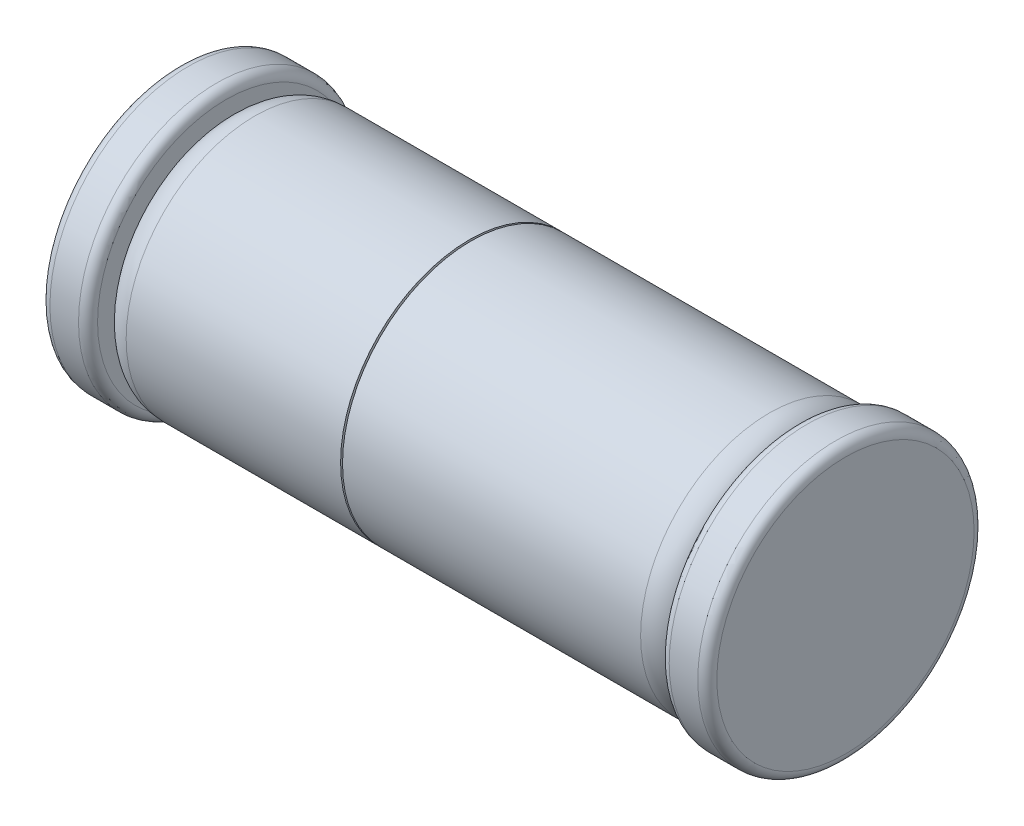
ISO-10303-21;
HEADER;
FILE_DESCRIPTION(('STEP AP214'),'2;1');
FILE_NAME('part.step','',(''),(''),'','','');
FILE_SCHEMA(('AUTOMOTIVE_DESIGN { 1 0 10303 214 1 1 1 1 }'));
ENDSEC;
DATA;
#1=APPLICATION_CONTEXT('core data for automotive mechanical design processes');
#2=APPLICATION_PROTOCOL_DEFINITION('international standard','automotive_design',2000,#1);
#3=PRODUCT_CONTEXT('',#1,'mechanical');
#4=PRODUCT('Part','Part','',(#3));
#5=PRODUCT_RELATED_PRODUCT_CATEGORY('part','',(#4));
#6=PRODUCT_DEFINITION_FORMATION('','',#4);
#7=PRODUCT_DEFINITION_CONTEXT('part definition',#1,'design');
#8=PRODUCT_DEFINITION('design','',#6,#7);
#9=PRODUCT_DEFINITION_SHAPE('','',#8);
#10=(LENGTH_UNIT() NAMED_UNIT(*) SI_UNIT(.MILLI.,.METRE.));
#11=(NAMED_UNIT(*) PLANE_ANGLE_UNIT() SI_UNIT($,.RADIAN.));
#12=(NAMED_UNIT(*) SI_UNIT($,.STERADIAN.) SOLID_ANGLE_UNIT());
#13=UNCERTAINTY_MEASURE_WITH_UNIT(LENGTH_MEASURE(1.E-05),#10,'distance_accuracy_value','');
#14=(GEOMETRIC_REPRESENTATION_CONTEXT(3) GLOBAL_UNCERTAINTY_ASSIGNED_CONTEXT((#13)) GLOBAL_UNIT_ASSIGNED_CONTEXT((#10,
#11,#12)) REPRESENTATION_CONTEXT('',''));
#15=CARTESIAN_POINT('',(0.,0.,0.));
#16=DIRECTION('',(0.,0.,1.));
#17=DIRECTION('',(1.,0.,0.));
#18=AXIS2_PLACEMENT_3D('',#15,#16,#17);
#19=CARTESIAN_POINT('',(-1.75,0.,-1.73642135624));
#20=DIRECTION('',(-1.,0.,0.));
#21=DIRECTION('',(0.,0.,1.));
#22=AXIS2_PLACEMENT_3D('',#19,#20,#21);
#23=PLANE('',#22);
#24=CARTESIAN_POINT('',(-1.75,0.,0.));
#25=DIRECTION('',(-1.,0.,0.));
#26=DIRECTION('',(0.,0.,1.));
#27=AXIS2_PLACEMENT_3D('',#24,#25,#26);
#28=CIRCLE('',#27,0.675);
#29=CARTESIAN_POINT('',(-1.75,0.,0.675));
#30=VERTEX_POINT('',#29);
#31=EDGE_CURVE('P0_E19',#30,#30,#28,.F.);
#32=ORIENTED_EDGE('',*,*,#31,.F.);
#33=EDGE_LOOP('',(#32));
#34=FACE_BOUND('',#33,.T.);
#35=ADVANCED_FACE('P0_F15',(#34),#23,.T.);
#36=CARTESIAN_POINT('',(-1.7,0.,0.));
#37=DIRECTION('',(-1.,0.,0.));
#38=DIRECTION('',(0.,0.,1.));
#39=AXIS2_PLACEMENT_3D('',#36,#37,#38);
#40=TOROIDAL_SURFACE('',#39,0.675,0.05);
#41=ORIENTED_EDGE('',*,*,#31,.T.);
#42=EDGE_LOOP('',(#41));
#43=FACE_BOUND('',#42,.T.);
#44=CARTESIAN_POINT('',(-1.7,0.,0.));
#45=DIRECTION('',(1.,0.,0.));
#46=DIRECTION('',(0.,0.,-1.));
#47=AXIS2_PLACEMENT_3D('',#44,#45,#46);
#48=CIRCLE('',#47,0.725);
#49=CARTESIAN_POINT('',(-1.7,0.,-0.725));
#50=VERTEX_POINT('',#49);
#51=EDGE_CURVE('P0_E35',#50,#50,#48,.T.);
#52=ORIENTED_EDGE('',*,*,#51,.F.);
#53=EDGE_LOOP('',(#52));
#54=FACE_BOUND('',#53,.T.);
#55=ADVANCED_FACE('P0_F100',(#43,#54),#40,.T.);
#56=CARTESIAN_POINT('',(-1.75,0.,0.));
#57=DIRECTION('',(1.,0.,0.));
#58=DIRECTION('',(0.,0.,-1.));
#59=AXIS2_PLACEMENT_3D('',#56,#57,#58);
#60=CYLINDRICAL_SURFACE('',#59,0.725);
#61=CARTESIAN_POINT('',(-1.55,0.,0.));
#62=DIRECTION('',(1.,0.,0.));
#63=DIRECTION('',(0.,0.,-1.));
#64=AXIS2_PLACEMENT_3D('',#61,#62,#63);
#65=CIRCLE('',#64,0.725);
#66=CARTESIAN_POINT('',(-1.55,0.,-0.725));
#67=VERTEX_POINT('',#66);
#68=EDGE_CURVE('P0_E31',#67,#67,#65,.T.);
#69=ORIENTED_EDGE('',*,*,#68,.F.);
#70=EDGE_LOOP('',(#69));
#71=FACE_BOUND('',#70,.T.);
#72=ORIENTED_EDGE('',*,*,#51,.T.);
#73=EDGE_LOOP('',(#72));
#74=FACE_BOUND('',#73,.T.);
#75=ADVANCED_FACE('P0_F56',(#71,#74),#60,.T.);
#76=CARTESIAN_POINT('',(-1.55,0.,0.));
#77=DIRECTION('',(-1.,0.,0.));
#78=DIRECTION('',(0.,0.,1.));
#79=AXIS2_PLACEMENT_3D('',#76,#77,#78);
#80=TOROIDAL_SURFACE('',#79,0.675,0.0499999999999999);
#81=ORIENTED_EDGE('',*,*,#68,.T.);
#82=EDGE_LOOP('',(#81));
#83=FACE_BOUND('',#82,.T.);
#84=CARTESIAN_POINT('',(-1.5,0.,0.));
#85=DIRECTION('',(-1.,0.,0.));
#86=DIRECTION('',(0.,0.,1.));
#87=AXIS2_PLACEMENT_3D('',#84,#85,#86);
#88=CIRCLE('',#87,0.675);
#89=CARTESIAN_POINT('',(-1.5,0.,0.675));
#90=VERTEX_POINT('',#89);
#91=EDGE_CURVE('P0_E34',#90,#90,#88,.T.);
#92=ORIENTED_EDGE('',*,*,#91,.T.);
#93=EDGE_LOOP('',(#92));
#94=FACE_BOUND('',#93,.T.);
#95=ADVANCED_FACE('P0_F42',(#83,#94),#80,.T.);
#96=CARTESIAN_POINT('',(-1.5,0.,-1.73642135624));
#97=DIRECTION('',(-1.,0.,0.));
#98=DIRECTION('',(0.,0.,1.));
#99=AXIS2_PLACEMENT_3D('',#96,#97,#98);
#100=PLANE('',#99);
#101=CARTESIAN_POINT('',(-1.5,0.,0.));
#102=DIRECTION('',(1.,0.,0.));
#103=DIRECTION('',(0.,0.,-1.));
#104=AXIS2_PLACEMENT_3D('',#101,#102,#103);
#105=CIRCLE('',#104,0.525);
#106=CARTESIAN_POINT('',(-1.5,0.,-0.525));
#107=VERTEX_POINT('',#106);
#108=EDGE_CURVE('P0_E28',#107,#107,#105,.T.);
#109=ORIENTED_EDGE('',*,*,#108,.F.);
#110=EDGE_LOOP('',(#109));
#111=FACE_BOUND('',#110,.T.);
#112=ORIENTED_EDGE('',*,*,#91,.F.);
#113=EDGE_LOOP('',(#112));
#114=FACE_BOUND('',#113,.T.);
#115=ADVANCED_FACE('P0_F44',(#111,#114),#100,.F.);
#116=CARTESIAN_POINT('',(-0.224521292122,-35.,-0.80870201188));
#117=DIRECTION('',(-1.,0.,0.));
#118=DIRECTION('',(0.,0.,1.));
#119=AXIS2_PLACEMENT_3D('',#116,#117,#118);
#120=PLANE('',#119);
#121=CARTESIAN_POINT('',(-0.224521292374,0.,0.));
#122=DIRECTION('',(-1.,0.,0.));
#123=DIRECTION('',(0.,0.,1.));
#124=AXIS2_PLACEMENT_3D('',#121,#122,#123);
#125=CIRCLE('',#124,0.675);
#126=CARTESIAN_POINT('',(-0.224521292374,0.,0.675));
#127=VERTEX_POINT('',#126);
#128=EDGE_CURVE('P0_E23',#127,#127,#125,.T.);
#129=ORIENTED_EDGE('',*,*,#128,.F.);
#130=EDGE_LOOP('',(#129));
#131=FACE_BOUND('',#130,.T.);
#132=ADVANCED_FACE('P0_F46',(#131),#120,.F.);
#133=CARTESIAN_POINT('',(-1.35,0.,0.));
#134=DIRECTION('',(1.,0.,0.));
#135=DIRECTION('',(0.,0.,-1.));
#136=AXIS2_PLACEMENT_3D('',#133,#134,#135);
#137=TOROIDAL_SURFACE('',#136,0.525,0.15);
#138=ORIENTED_EDGE('',*,*,#108,.T.);
#139=EDGE_LOOP('',(#138));
#140=FACE_BOUND('',#139,.T.);
#141=CARTESIAN_POINT('',(-1.35,0.,0.));
#142=DIRECTION('',(-1.,0.,0.));
#143=DIRECTION('',(0.,0.,1.));
#144=AXIS2_PLACEMENT_3D('',#141,#142,#143);
#145=CIRCLE('',#144,0.675);
#146=CARTESIAN_POINT('',(-1.35,0.,0.675));
#147=VERTEX_POINT('',#146);
#148=EDGE_CURVE('P0_E10',#147,#147,#145,.F.);
#149=ORIENTED_EDGE('',*,*,#148,.F.);
#150=EDGE_LOOP('',(#149));
#151=FACE_BOUND('',#150,.T.);
#152=ADVANCED_FACE('P0_F17',(#140,#151),#137,.T.);
#153=CARTESIAN_POINT('',(1.5,0.,0.));
#154=DIRECTION('',(-1.,0.,0.));
#155=DIRECTION('',(0.,0.,1.));
#156=AXIS2_PLACEMENT_3D('',#153,#154,#155);
#157=CYLINDRICAL_SURFACE('',#156,0.675);
#158=ORIENTED_EDGE('',*,*,#128,.T.);
#159=EDGE_LOOP('',(#158));
#160=FACE_BOUND('',#159,.T.);
#161=ORIENTED_EDGE('',*,*,#148,.T.);
#162=EDGE_LOOP('',(#161));
#163=FACE_BOUND('',#162,.T.);
#164=ADVANCED_FACE('P0_F60',(#160,#163),#157,.T.);
#165=CLOSED_SHELL('',(#35,#55,#75,#95,#115,#132,#152,#164));
#166=MANIFOLD_SOLID_BREP('P0_B1',#165);
#167=CARTESIAN_POINT('',(1.75,0.,-1.73642135624));
#168=DIRECTION('',(1.,0.,0.));
#169=DIRECTION('',(0.,0.,-1.));
#170=AXIS2_PLACEMENT_3D('',#167,#168,#169);
#171=PLANE('',#170);
#172=CARTESIAN_POINT('',(1.75,0.,0.));
#173=DIRECTION('',(1.,0.,0.));
#174=DIRECTION('',(0.,0.,-1.));
#175=AXIS2_PLACEMENT_3D('',#172,#173,#174);
#176=CIRCLE('',#175,0.675);
#177=CARTESIAN_POINT('',(1.75,0.,-0.675));
#178=VERTEX_POINT('',#177);
#179=EDGE_CURVE('P1_E19',#178,#178,#176,.F.);
#180=ORIENTED_EDGE('',*,*,#179,.F.);
#181=EDGE_LOOP('',(#180));
#182=FACE_BOUND('',#181,.T.);
#183=ADVANCED_FACE('P1_F15',(#182),#171,.T.);
#184=CARTESIAN_POINT('',(1.7,0.,0.));
#185=DIRECTION('',(1.,0.,0.));
#186=DIRECTION('',(0.,0.,-1.));
#187=AXIS2_PLACEMENT_3D('',#184,#185,#186);
#188=TOROIDAL_SURFACE('',#187,0.675,0.05);
#189=ORIENTED_EDGE('',*,*,#179,.T.);
#190=EDGE_LOOP('',(#189));
#191=FACE_BOUND('',#190,.T.);
#192=CARTESIAN_POINT('',(1.7,0.,0.));
#193=DIRECTION('',(-1.,0.,0.));
#194=DIRECTION('',(0.,0.,1.));
#195=AXIS2_PLACEMENT_3D('',#192,#193,#194);
#196=CIRCLE('',#195,0.725);
#197=CARTESIAN_POINT('',(1.7,0.,0.725));
#198=VERTEX_POINT('',#197);
#199=EDGE_CURVE('P1_E32',#198,#198,#196,.T.);
#200=ORIENTED_EDGE('',*,*,#199,.F.);
#201=EDGE_LOOP('',(#200));
#202=FACE_BOUND('',#201,.T.);
#203=ADVANCED_FACE('P1_F49',(#191,#202),#188,.T.);
#204=CARTESIAN_POINT('',(1.75,0.,0.));
#205=DIRECTION('',(-1.,0.,0.));
#206=DIRECTION('',(0.,0.,1.));
#207=AXIS2_PLACEMENT_3D('',#204,#205,#206);
#208=CYLINDRICAL_SURFACE('',#207,0.725);
#209=CARTESIAN_POINT('',(1.55,0.,0.));
#210=DIRECTION('',(-1.,0.,0.));
#211=DIRECTION('',(0.,0.,1.));
#212=AXIS2_PLACEMENT_3D('',#209,#210,#211);
#213=CIRCLE('',#212,0.725);
#214=CARTESIAN_POINT('',(1.55,0.,0.725));
#215=VERTEX_POINT('',#214);
#216=EDGE_CURVE('P1_E37',#215,#215,#213,.T.);
#217=ORIENTED_EDGE('',*,*,#216,.F.);
#218=EDGE_LOOP('',(#217));
#219=FACE_BOUND('',#218,.T.);
#220=ORIENTED_EDGE('',*,*,#199,.T.);
#221=EDGE_LOOP('',(#220));
#222=FACE_BOUND('',#221,.T.);
#223=ADVANCED_FACE('P1_F58',(#219,#222),#208,.T.);
#224=CARTESIAN_POINT('',(1.55,0.,0.));
#225=DIRECTION('',(1.,0.,0.));
#226=DIRECTION('',(0.,0.,-1.));
#227=AXIS2_PLACEMENT_3D('',#224,#225,#226);
#228=TOROIDAL_SURFACE('',#227,0.675,0.0499999999999999);
#229=ORIENTED_EDGE('',*,*,#216,.T.);
#230=EDGE_LOOP('',(#229));
#231=FACE_BOUND('',#230,.T.);
#232=CARTESIAN_POINT('',(1.5,0.,0.));
#233=DIRECTION('',(1.,0.,0.));
#234=DIRECTION('',(0.,0.,-1.));
#235=AXIS2_PLACEMENT_3D('',#232,#233,#234);
#236=CIRCLE('',#235,0.675);
#237=CARTESIAN_POINT('',(1.5,0.,-0.675));
#238=VERTEX_POINT('',#237);
#239=EDGE_CURVE('P1_E35',#238,#238,#236,.T.);
#240=ORIENTED_EDGE('',*,*,#239,.T.);
#241=EDGE_LOOP('',(#240));
#242=FACE_BOUND('',#241,.T.);
#243=ADVANCED_FACE('P1_F74',(#231,#242),#228,.T.);
#244=CARTESIAN_POINT('',(1.5,0.,-1.73642135624));
#245=DIRECTION('',(1.,0.,0.));
#246=DIRECTION('',(0.,0.,-1.));
#247=AXIS2_PLACEMENT_3D('',#244,#245,#246);
#248=PLANE('',#247);
#249=CARTESIAN_POINT('',(1.5,0.,0.));
#250=DIRECTION('',(1.,0.,0.));
#251=DIRECTION('',(0.,1.,0.));
#252=AXIS2_PLACEMENT_3D('',#249,#250,#251);
#253=CIRCLE('',#252,0.525);
#254=CARTESIAN_POINT('',(1.5,0.525,0.));
#255=VERTEX_POINT('',#254);
#256=EDGE_CURVE('P1_E28',#255,#255,#253,.F.);
#257=ORIENTED_EDGE('',*,*,#256,.F.);
#258=EDGE_LOOP('',(#257));
#259=FACE_BOUND('',#258,.T.);
#260=ORIENTED_EDGE('',*,*,#239,.F.);
#261=EDGE_LOOP('',(#260));
#262=FACE_BOUND('',#261,.T.);
#263=ADVANCED_FACE('P1_F72',(#259,#262),#248,.F.);
#264=CARTESIAN_POINT('',(1.35,0.,0.));
#265=DIRECTION('',(1.,0.,0.));
#266=DIRECTION('',(0.,1.,0.));
#267=AXIS2_PLACEMENT_3D('',#264,#265,#266);
#268=TOROIDAL_SURFACE('',#267,0.525,0.15);
#269=ORIENTED_EDGE('',*,*,#256,.T.);
#270=EDGE_LOOP('',(#269));
#271=FACE_BOUND('',#270,.T.);
#272=CARTESIAN_POINT('',(1.35,0.,0.));
#273=DIRECTION('',(-1.,0.,0.));
#274=DIRECTION('',(0.,0.,1.));
#275=AXIS2_PLACEMENT_3D('',#272,#273,#274);
#276=CIRCLE('',#275,0.675);
#277=CARTESIAN_POINT('',(1.35,0.,0.675));
#278=VERTEX_POINT('',#277);
#279=EDGE_CURVE('P1_E23',#278,#278,#276,.T.);
#280=ORIENTED_EDGE('',*,*,#279,.F.);
#281=EDGE_LOOP('',(#280));
#282=FACE_BOUND('',#281,.T.);
#283=ADVANCED_FACE('P1_F17',(#271,#282),#268,.T.);
#284=CARTESIAN_POINT('',(-0.214521292122,-35.,0.947015680104));
#285=DIRECTION('',(1.,0.,0.));
#286=DIRECTION('',(0.,1.,0.));
#287=AXIS2_PLACEMENT_3D('',#284,#285,#286);
#288=PLANE('',#287);
#289=CARTESIAN_POINT('',(-0.214521292597,0.,0.));
#290=DIRECTION('',(-1.,0.,0.));
#291=DIRECTION('',(0.,0.,1.));
#292=AXIS2_PLACEMENT_3D('',#289,#290,#291);
#293=CIRCLE('',#292,0.675);
#294=CARTESIAN_POINT('',(-0.214521292597,0.,0.675));
#295=VERTEX_POINT('',#294);
#296=EDGE_CURVE('P1_E10',#295,#295,#293,.F.);
#297=ORIENTED_EDGE('',*,*,#296,.F.);
#298=EDGE_LOOP('',(#297));
#299=FACE_BOUND('',#298,.T.);
#300=ADVANCED_FACE('P1_F63',(#299),#288,.F.);
#301=CARTESIAN_POINT('',(1.5,0.,0.));
#302=DIRECTION('',(-1.,0.,0.));
#303=DIRECTION('',(0.,0.,1.));
#304=AXIS2_PLACEMENT_3D('',#301,#302,#303);
#305=CYLINDRICAL_SURFACE('',#304,0.675);
#306=ORIENTED_EDGE('',*,*,#296,.T.);
#307=EDGE_LOOP('',(#306));
#308=FACE_BOUND('',#307,.T.);
#309=ORIENTED_EDGE('',*,*,#279,.T.);
#310=EDGE_LOOP('',(#309));
#311=FACE_BOUND('',#310,.T.);
#312=ADVANCED_FACE('P1_F61',(#308,#311),#305,.T.);
#313=CLOSED_SHELL('',(#183,#203,#223,#243,#263,#283,#300,#312));
#314=MANIFOLD_SOLID_BREP('P1_B1',#313);
#315=ADVANCED_BREP_SHAPE_REPRESENTATION('',(#18,#166,#314),#14);
#316=SHAPE_DEFINITION_REPRESENTATION(#9,#315);
ENDSEC;
END-ISO-10303-21;
